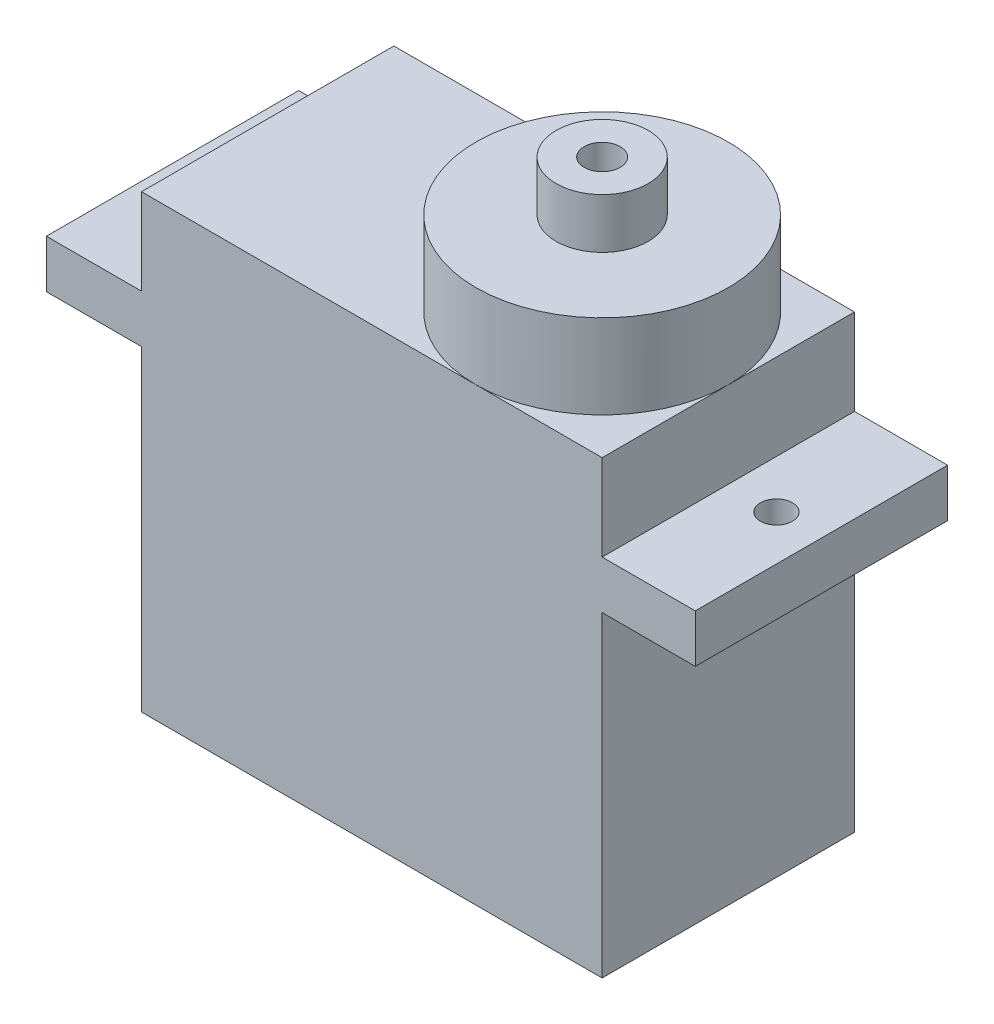
ISO-10303-21;
HEADER;
FILE_DESCRIPTION(('STEP AP214'),'2;1');
FILE_NAME('part.step','',(''),(''),'','','');
FILE_SCHEMA(('AUTOMOTIVE_DESIGN { 1 0 10303 214 1 1 1 1 }'));
ENDSEC;
DATA;
#1=APPLICATION_CONTEXT('core data for automotive mechanical design processes');
#2=APPLICATION_PROTOCOL_DEFINITION('international standard','automotive_design',2000,#1);
#3=PRODUCT_CONTEXT('',#1,'mechanical');
#4=PRODUCT('Part','Part','',(#3));
#5=PRODUCT_RELATED_PRODUCT_CATEGORY('part','',(#4));
#6=PRODUCT_DEFINITION_FORMATION('','',#4);
#7=PRODUCT_DEFINITION_CONTEXT('part definition',#1,'design');
#8=PRODUCT_DEFINITION('design','',#6,#7);
#9=PRODUCT_DEFINITION_SHAPE('','',#8);
#10=(LENGTH_UNIT() NAMED_UNIT(*) SI_UNIT(.MILLI.,.METRE.));
#11=(NAMED_UNIT(*) PLANE_ANGLE_UNIT() SI_UNIT($,.RADIAN.));
#12=(NAMED_UNIT(*) SI_UNIT($,.STERADIAN.) SOLID_ANGLE_UNIT());
#13=UNCERTAINTY_MEASURE_WITH_UNIT(LENGTH_MEASURE(1.E-05),#10,'distance_accuracy_value','');
#14=(GEOMETRIC_REPRESENTATION_CONTEXT(3) GLOBAL_UNCERTAINTY_ASSIGNED_CONTEXT((#13)) GLOBAL_UNIT_ASSIGNED_CONTEXT((#10,
#11,#12)) REPRESENTATION_CONTEXT('',''));
#15=CARTESIAN_POINT('',(0.,0.,0.));
#16=DIRECTION('',(0.,0.,1.));
#17=DIRECTION('',(1.,0.,0.));
#18=AXIS2_PLACEMENT_3D('',#15,#16,#17);
#19=CARTESIAN_POINT('',(-11.5,11.25,12.6));
#20=DIRECTION('',(0.,-1.,0.));
#21=DIRECTION('',(0.,0.,-1.));
#22=AXIS2_PLACEMENT_3D('',#19,#20,#21);
#23=PLANE('',#22);
#24=CARTESIAN_POINT('',(5.2,11.25,6.3));
#25=DIRECTION('',(0.,1.,0.));
#26=DIRECTION('',(0.,0.,1.));
#27=AXIS2_PLACEMENT_3D('',#24,#25,#26);
#28=CIRCLE('',#27,6.3);
#29=CARTESIAN_POINT('',(5.2,11.25,12.6));
#30=VERTEX_POINT('',#29);
#31=CARTESIAN_POINT('',(11.5,11.25,6.3));
#32=VERTEX_POINT('',#31);
#33=EDGE_CURVE('E160',#30,#32,#28,.T.);
#34=ORIENTED_EDGE('',*,*,#33,.F.);
#35=DIRECTION('',(-1.,0.,0.));
#36=VECTOR('',#35,1.);
#37=CARTESIAN_POINT('',(-11.5,11.25,12.6));
#38=LINE('',#37,#36);
#39=CARTESIAN_POINT('',(11.5,11.25,12.6));
#40=VERTEX_POINT('',#39);
#41=EDGE_CURVE('E141',#40,#30,#38,.T.);
#42=ORIENTED_EDGE('',*,*,#41,.F.);
#43=DIRECTION('',(0.,0.,-1.));
#44=VECTOR('',#43,1.);
#45=CARTESIAN_POINT('',(11.5,11.25,12.6));
#46=LINE('',#45,#44);
#47=EDGE_CURVE('E161',#40,#32,#46,.T.);
#48=ORIENTED_EDGE('',*,*,#47,.T.);
#49=EDGE_LOOP('',(#34,#42,#48));
#50=FACE_BOUND('',#49,.T.);
#51=ADVANCED_FACE('F41',(#50),#23,.F.);
#52=CARTESIAN_POINT('',(5.2,11.25,0.));
#53=VERTEX_POINT('',#52);
#54=EDGE_CURVE('E50',#32,#53,#28,.T.);
#55=ORIENTED_EDGE('',*,*,#54,.F.);
#56=CARTESIAN_POINT('',(11.5,11.25,0.));
#57=VERTEX_POINT('',#56);
#58=EDGE_CURVE('E167',#32,#57,#46,.T.);
#59=ORIENTED_EDGE('',*,*,#58,.T.);
#60=DIRECTION('',(-1.,0.,0.));
#61=VECTOR('',#60,1.);
#62=CARTESIAN_POINT('',(-11.5,11.25,0.));
#63=LINE('',#62,#61);
#64=EDGE_CURVE('E229',#57,#53,#63,.T.);
#65=ORIENTED_EDGE('',*,*,#64,.T.);
#66=EDGE_LOOP('',(#55,#59,#65));
#67=FACE_BOUND('',#66,.T.);
#68=ADVANCED_FACE('F244',(#67),#23,.F.);
#69=CARTESIAN_POINT('',(11.5,11.25,12.6));
#70=DIRECTION('',(-1.,0.,0.));
#71=DIRECTION('',(0.,-1.,0.));
#72=AXIS2_PLACEMENT_3D('',#69,#70,#71);
#73=PLANE('',#72);
#74=DIRECTION('',(0.,0.,-1.));
#75=VECTOR('',#74,1.);
#76=CARTESIAN_POINT('',(11.5,4.55,12.6));
#77=LINE('',#76,#75);
#78=CARTESIAN_POINT('',(11.5,4.55000000000001,12.6));
#79=VERTEX_POINT('',#78);
#80=CARTESIAN_POINT('',(11.5,4.55000000000001,0.));
#81=VERTEX_POINT('',#80);
#82=EDGE_CURVE('E215',#79,#81,#77,.T.);
#83=ORIENTED_EDGE('',*,*,#82,.F.);
#84=DIRECTION('',(0.,1.,0.));
#85=VECTOR('',#84,1.);
#86=CARTESIAN_POINT('',(11.5,11.25,12.6));
#87=LINE('',#86,#85);
#88=CARTESIAN_POINT('',(11.5,-11.25,12.6));
#89=VERTEX_POINT('',#88);
#90=EDGE_CURVE('E158',#89,#79,#87,.T.);
#91=ORIENTED_EDGE('',*,*,#90,.F.);
#92=DIRECTION('',(0.,0.,-1.));
#93=VECTOR('',#92,1.);
#94=CARTESIAN_POINT('',(11.5,-11.25,12.6));
#95=LINE('',#94,#93);
#96=CARTESIAN_POINT('',(11.5,-11.25,0.));
#97=VERTEX_POINT('',#96);
#98=EDGE_CURVE('E225',#89,#97,#95,.T.);
#99=ORIENTED_EDGE('',*,*,#98,.T.);
#100=DIRECTION('',(0.,1.,0.));
#101=VECTOR('',#100,1.);
#102=CARTESIAN_POINT('',(11.5,11.25,0.));
#103=LINE('',#102,#101);
#104=EDGE_CURVE('E226',#97,#81,#103,.T.);
#105=ORIENTED_EDGE('',*,*,#104,.T.);
#106=EDGE_LOOP('',(#83,#91,#99,#105));
#107=FACE_BOUND('',#106,.T.);
#108=ADVANCED_FACE('F279',(#107),#73,.F.);
#109=CARTESIAN_POINT('',(-11.5,11.25,12.6));
#110=DIRECTION('',(1.,0.,0.));
#111=DIRECTION('',(0.,1.,0.));
#112=AXIS2_PLACEMENT_3D('',#109,#110,#111);
#113=PLANE('',#112);
#114=DIRECTION('',(0.,0.,1.));
#115=VECTOR('',#114,1.);
#116=CARTESIAN_POINT('',(-11.5,4.55,12.6));
#117=LINE('',#116,#115);
#118=CARTESIAN_POINT('',(-11.5,4.55,0.));
#119=VERTEX_POINT('',#118);
#120=CARTESIAN_POINT('',(-11.5,4.55000000000001,12.6));
#121=VERTEX_POINT('',#120);
#122=EDGE_CURVE('E212',#119,#121,#117,.T.);
#123=ORIENTED_EDGE('',*,*,#122,.F.);
#124=DIRECTION('',(0.,-1.,0.));
#125=VECTOR('',#124,1.);
#126=CARTESIAN_POINT('',(-11.5,11.25,0.));
#127=LINE('',#126,#125);
#128=CARTESIAN_POINT('',(-11.5,-11.25,0.));
#129=VERTEX_POINT('',#128);
#130=EDGE_CURVE('E231',#119,#129,#127,.T.);
#131=ORIENTED_EDGE('',*,*,#130,.T.);
#132=DIRECTION('',(0.,0.,-1.));
#133=VECTOR('',#132,1.);
#134=CARTESIAN_POINT('',(-11.5,-11.25,12.6));
#135=LINE('',#134,#133);
#136=CARTESIAN_POINT('',(-11.5,-11.25,12.6));
#137=VERTEX_POINT('',#136);
#138=EDGE_CURVE('E238',#137,#129,#135,.T.);
#139=ORIENTED_EDGE('',*,*,#138,.F.);
#140=DIRECTION('',(0.,-1.,0.));
#141=VECTOR('',#140,1.);
#142=CARTESIAN_POINT('',(-11.5,11.25,12.6));
#143=LINE('',#142,#141);
#144=EDGE_CURVE('E152',#121,#137,#143,.T.);
#145=ORIENTED_EDGE('',*,*,#144,.F.);
#146=EDGE_LOOP('',(#123,#131,#139,#145));
#147=FACE_BOUND('',#146,.T.);
#148=ADVANCED_FACE('F268',(#147),#113,.F.);
#149=CARTESIAN_POINT('',(11.5,6.95,12.6));
#150=VERTEX_POINT('',#149);
#151=EDGE_CURVE('E147',#150,#40,#87,.T.);
#152=ORIENTED_EDGE('',*,*,#151,.F.);
#153=DIRECTION('',(0.,0.,-1.));
#154=VECTOR('',#153,1.);
#155=CARTESIAN_POINT('',(11.5,6.95,12.6));
#156=LINE('',#155,#154);
#157=CARTESIAN_POINT('',(11.5,6.95,0.));
#158=VERTEX_POINT('',#157);
#159=EDGE_CURVE('E209',#150,#158,#156,.T.);
#160=ORIENTED_EDGE('',*,*,#159,.T.);
#161=EDGE_CURVE('E218',#158,#57,#103,.T.);
#162=ORIENTED_EDGE('',*,*,#161,.T.);
#163=ORIENTED_EDGE('',*,*,#58,.F.);
#164=ORIENTED_EDGE('',*,*,#47,.F.);
#165=EDGE_LOOP('',(#152,#160,#162,#163,#164));
#166=FACE_BOUND('',#165,.T.);
#167=ADVANCED_FACE('F43',(#166),#73,.F.);
#168=EDGE_CURVE('E65',#53,#30,#28,.T.);
#169=ORIENTED_EDGE('',*,*,#168,.F.);
#170=CARTESIAN_POINT('',(-11.5,11.25,0.));
#171=VERTEX_POINT('',#170);
#172=EDGE_CURVE('E228',#53,#171,#63,.T.);
#173=ORIENTED_EDGE('',*,*,#172,.T.);
#174=DIRECTION('',(0.,0.,-1.));
#175=VECTOR('',#174,1.);
#176=CARTESIAN_POINT('',(-11.5,11.25,12.6));
#177=LINE('',#176,#175);
#178=CARTESIAN_POINT('',(-11.5,11.25,12.6));
#179=VERTEX_POINT('',#178);
#180=EDGE_CURVE('E156',#179,#171,#177,.T.);
#181=ORIENTED_EDGE('',*,*,#180,.F.);
#182=EDGE_CURVE('E144',#30,#179,#38,.T.);
#183=ORIENTED_EDGE('',*,*,#182,.F.);
#184=EDGE_LOOP('',(#169,#173,#181,#183));
#185=FACE_BOUND('',#184,.T.);
#186=ADVANCED_FACE('F154',(#185),#23,.F.);
#187=CARTESIAN_POINT('',(-11.5,6.95,0.));
#188=VERTEX_POINT('',#187);
#189=EDGE_CURVE('E232',#171,#188,#127,.T.);
#190=ORIENTED_EDGE('',*,*,#189,.T.);
#191=DIRECTION('',(0.,0.,1.));
#192=VECTOR('',#191,1.);
#193=CARTESIAN_POINT('',(-11.5,6.95,12.6));
#194=LINE('',#193,#192);
#195=CARTESIAN_POINT('',(-11.5,6.95,12.6));
#196=VERTEX_POINT('',#195);
#197=EDGE_CURVE('E207',#188,#196,#194,.T.);
#198=ORIENTED_EDGE('',*,*,#197,.T.);
#199=EDGE_CURVE('E221',#179,#196,#143,.T.);
#200=ORIENTED_EDGE('',*,*,#199,.F.);
#201=ORIENTED_EDGE('',*,*,#180,.T.);
#202=EDGE_LOOP('',(#190,#198,#200,#201));
#203=FACE_BOUND('',#202,.T.);
#204=ADVANCED_FACE('F254',(#203),#113,.F.);
#205=CARTESIAN_POINT('',(-11.5,-11.25,12.6));
#206=DIRECTION('',(0.,1.,0.));
#207=DIRECTION('',(0.,0.,1.));
#208=AXIS2_PLACEMENT_3D('',#205,#206,#207);
#209=PLANE('',#208);
#210=DIRECTION('',(1.,0.,0.));
#211=VECTOR('',#210,1.);
#212=CARTESIAN_POINT('',(-11.5,-11.25,0.));
#213=LINE('',#212,#211);
#214=EDGE_CURVE('E234',#129,#97,#213,.T.);
#215=ORIENTED_EDGE('',*,*,#214,.T.);
#216=ORIENTED_EDGE('',*,*,#98,.F.);
#217=DIRECTION('',(1.,0.,0.));
#218=VECTOR('',#217,1.);
#219=CARTESIAN_POINT('',(-11.5,-11.25,12.6));
#220=LINE('',#219,#218);
#221=EDGE_CURVE('E223',#137,#89,#220,.T.);
#222=ORIENTED_EDGE('',*,*,#221,.F.);
#223=ORIENTED_EDGE('',*,*,#138,.T.);
#224=EDGE_LOOP('',(#215,#216,#222,#223));
#225=FACE_BOUND('',#224,.T.);
#226=ADVANCED_FACE('F275',(#225),#209,.F.);
#227=CARTESIAN_POINT('',(0.,0.,12.6));
#228=DIRECTION('',(0.,0.,1.));
#229=DIRECTION('',(1.,0.,0.));
#230=AXIS2_PLACEMENT_3D('',#227,#228,#229);
#231=PLANE('',#230);
#232=ORIENTED_EDGE('',*,*,#199,.T.);
#233=DIRECTION('',(1.,0.,0.));
#234=VECTOR('',#233,1.);
#235=CARTESIAN_POINT('',(-16.25,6.95,12.6));
#236=LINE('',#235,#234);
#237=CARTESIAN_POINT('',(-16.25,6.95,12.6));
#238=VERTEX_POINT('',#237);
#239=EDGE_CURVE('E178',#238,#196,#236,.T.);
#240=ORIENTED_EDGE('',*,*,#239,.F.);
#241=DIRECTION('',(0.,-1.,0.));
#242=VECTOR('',#241,1.);
#243=CARTESIAN_POINT('',(-16.25,6.95,12.6));
#244=LINE('',#243,#242);
#245=CARTESIAN_POINT('',(-16.25,4.55,12.6));
#246=VERTEX_POINT('',#245);
#247=EDGE_CURVE('E181',#238,#246,#244,.T.);
#248=ORIENTED_EDGE('',*,*,#247,.T.);
#249=DIRECTION('',(1.,0.,0.));
#250=VECTOR('',#249,1.);
#251=CARTESIAN_POINT('',(-16.25,4.55,12.6));
#252=LINE('',#251,#250);
#253=EDGE_CURVE('E170',#246,#121,#252,.T.);
#254=ORIENTED_EDGE('',*,*,#253,.T.);
#255=ORIENTED_EDGE('',*,*,#144,.T.);
#256=ORIENTED_EDGE('',*,*,#221,.T.);
#257=ORIENTED_EDGE('',*,*,#90,.T.);
#258=CARTESIAN_POINT('',(16.15,4.55,12.6));
#259=VERTEX_POINT('',#258);
#260=EDGE_CURVE('E174',#79,#259,#252,.T.);
#261=ORIENTED_EDGE('',*,*,#260,.T.);
#262=DIRECTION('',(0.,-1.,0.));
#263=VECTOR('',#262,1.);
#264=CARTESIAN_POINT('',(16.15,6.95,12.6));
#265=LINE('',#264,#263);
#266=CARTESIAN_POINT('',(16.15,6.95,12.6));
#267=VERTEX_POINT('',#266);
#268=EDGE_CURVE('E173',#267,#259,#265,.T.);
#269=ORIENTED_EDGE('',*,*,#268,.F.);
#270=EDGE_CURVE('E177',#150,#267,#236,.T.);
#271=ORIENTED_EDGE('',*,*,#270,.F.);
#272=ORIENTED_EDGE('',*,*,#151,.T.);
#273=ORIENTED_EDGE('',*,*,#41,.T.);
#274=ORIENTED_EDGE('',*,*,#182,.T.);
#275=EDGE_LOOP('',(#232,#240,#248,#254,#255,#256,#257,#261,#269,#271,#272,#273,#274));
#276=FACE_BOUND('',#275,.T.);
#277=ADVANCED_FACE('F143',(#276),#231,.T.);
#278=CARTESIAN_POINT('',(0.,0.,0.));
#279=DIRECTION('',(0.,0.,1.));
#280=DIRECTION('',(1.,0.,0.));
#281=AXIS2_PLACEMENT_3D('',#278,#279,#280);
#282=PLANE('',#281);
#283=ORIENTED_EDGE('',*,*,#161,.F.);
#284=DIRECTION('',(1.,0.,0.));
#285=VECTOR('',#284,1.);
#286=CARTESIAN_POINT('',(-16.25,6.95,0.));
#287=LINE('',#286,#285);
#288=CARTESIAN_POINT('',(16.15,6.95,0.));
#289=VERTEX_POINT('',#288);
#290=EDGE_CURVE('E191',#158,#289,#287,.T.);
#291=ORIENTED_EDGE('',*,*,#290,.T.);
#292=DIRECTION('',(0.,-1.,0.));
#293=VECTOR('',#292,1.);
#294=CARTESIAN_POINT('',(16.15,6.95,0.));
#295=LINE('',#294,#293);
#296=CARTESIAN_POINT('',(16.15,4.55,0.));
#297=VERTEX_POINT('',#296);
#298=EDGE_CURVE('E187',#289,#297,#295,.T.);
#299=ORIENTED_EDGE('',*,*,#298,.T.);
#300=DIRECTION('',(1.,0.,0.));
#301=VECTOR('',#300,1.);
#302=CARTESIAN_POINT('',(-16.25,4.55,0.));
#303=LINE('',#302,#301);
#304=EDGE_CURVE('E188',#81,#297,#303,.T.);
#305=ORIENTED_EDGE('',*,*,#304,.F.);
#306=ORIENTED_EDGE('',*,*,#104,.F.);
#307=ORIENTED_EDGE('',*,*,#214,.F.);
#308=ORIENTED_EDGE('',*,*,#130,.F.);
#309=CARTESIAN_POINT('',(-16.25,4.55,0.));
#310=VERTEX_POINT('',#309);
#311=EDGE_CURVE('E184',#310,#119,#303,.T.);
#312=ORIENTED_EDGE('',*,*,#311,.F.);
#313=DIRECTION('',(0.,-1.,0.));
#314=VECTOR('',#313,1.);
#315=CARTESIAN_POINT('',(-16.25,6.95,0.));
#316=LINE('',#315,#314);
#317=CARTESIAN_POINT('',(-16.25,6.95,0.));
#318=VERTEX_POINT('',#317);
#319=EDGE_CURVE('E195',#318,#310,#316,.T.);
#320=ORIENTED_EDGE('',*,*,#319,.F.);
#321=EDGE_CURVE('E192',#318,#188,#287,.T.);
#322=ORIENTED_EDGE('',*,*,#321,.T.);
#323=ORIENTED_EDGE('',*,*,#189,.F.);
#324=ORIENTED_EDGE('',*,*,#172,.F.);
#325=ORIENTED_EDGE('',*,*,#64,.F.);
#326=EDGE_LOOP('',(#283,#291,#299,#305,#306,#307,#308,#312,#320,#322,#323,#324,#325));
#327=FACE_BOUND('',#326,.T.);
#328=ADVANCED_FACE('F250',(#327),#282,.F.);
#329=CARTESIAN_POINT('',(-16.25,6.95,12.6));
#330=DIRECTION('',(1.,0.,0.));
#331=DIRECTION('',(0.,0.,-1.));
#332=AXIS2_PLACEMENT_3D('',#329,#330,#331);
#333=PLANE('',#332);
#334=ORIENTED_EDGE('',*,*,#319,.T.);
#335=DIRECTION('',(0.,0.,-1.));
#336=VECTOR('',#335,1.);
#337=CARTESIAN_POINT('',(-16.25,4.55,12.6));
#338=LINE('',#337,#336);
#339=EDGE_CURVE('E183',#246,#310,#338,.T.);
#340=ORIENTED_EDGE('',*,*,#339,.F.);
#341=ORIENTED_EDGE('',*,*,#247,.F.);
#342=DIRECTION('',(0.,0.,-1.));
#343=VECTOR('',#342,1.);
#344=CARTESIAN_POINT('',(-16.25,6.95,12.6));
#345=LINE('',#344,#343);
#346=EDGE_CURVE('E199',#238,#318,#345,.T.);
#347=ORIENTED_EDGE('',*,*,#346,.T.);
#348=EDGE_LOOP('',(#334,#340,#341,#347));
#349=FACE_BOUND('',#348,.T.);
#350=ADVANCED_FACE('F262',(#349),#333,.F.);
#351=CARTESIAN_POINT('',(-16.25,6.95,12.6));
#352=DIRECTION('',(0.,1.,0.));
#353=DIRECTION('',(0.,0.,1.));
#354=AXIS2_PLACEMENT_3D('',#351,#352,#353);
#355=PLANE('',#354);
#356=CARTESIAN_POINT('',(-13.9,6.95,6.3));
#357=DIRECTION('',(0.,1.,0.));
#358=DIRECTION('',(0.,0.,1.));
#359=AXIS2_PLACEMENT_3D('',#356,#357,#358);
#360=CIRCLE('',#359,0.799999999999988);
#361=CARTESIAN_POINT('',(-13.9,6.95,7.09999999999999));
#362=VERTEX_POINT('',#361);
#363=EDGE_CURVE('E530',#362,#362,#360,.T.);
#364=ORIENTED_EDGE('',*,*,#363,.F.);
#365=EDGE_LOOP('',(#364));
#366=FACE_BOUND('',#365,.T.);
#367=ORIENTED_EDGE('',*,*,#197,.F.);
#368=ORIENTED_EDGE('',*,*,#321,.F.);
#369=ORIENTED_EDGE('',*,*,#346,.F.);
#370=ORIENTED_EDGE('',*,*,#239,.T.);
#371=EDGE_LOOP('',(#367,#368,#369,#370));
#372=FACE_BOUND('',#371,.T.);
#373=ADVANCED_FACE('F256',(#366,#372),#355,.T.);
#374=CARTESIAN_POINT('',(-16.25,4.55,12.6));
#375=DIRECTION('',(0.,1.,0.));
#376=DIRECTION('',(0.,0.,1.));
#377=AXIS2_PLACEMENT_3D('',#374,#375,#376);
#378=PLANE('',#377);
#379=CARTESIAN_POINT('',(-13.9,4.55,6.3));
#380=DIRECTION('',(0.,1.,0.));
#381=DIRECTION('',(0.,0.,1.));
#382=AXIS2_PLACEMENT_3D('',#379,#380,#381);
#383=CIRCLE('',#382,0.799999999999993);
#384=CARTESIAN_POINT('',(-13.9,4.55,7.09999999999999));
#385=VERTEX_POINT('',#384);
#386=EDGE_CURVE('E45',#385,#385,#383,.T.);
#387=ORIENTED_EDGE('',*,*,#386,.T.);
#388=EDGE_LOOP('',(#387));
#389=FACE_BOUND('',#388,.T.);
#390=ORIENTED_EDGE('',*,*,#311,.T.);
#391=ORIENTED_EDGE('',*,*,#122,.T.);
#392=ORIENTED_EDGE('',*,*,#253,.F.);
#393=ORIENTED_EDGE('',*,*,#339,.T.);
#394=EDGE_LOOP('',(#390,#391,#392,#393));
#395=FACE_BOUND('',#394,.T.);
#396=ADVANCED_FACE('F265',(#389,#395),#378,.F.);
#397=CARTESIAN_POINT('',(13.9,4.55,6.3));
#398=DIRECTION('',(0.,1.,0.));
#399=DIRECTION('',(0.,0.,1.));
#400=AXIS2_PLACEMENT_3D('',#397,#398,#399);
#401=CIRCLE('',#400,0.799999999999993);
#402=CARTESIAN_POINT('',(13.9,4.55,7.09999999999999));
#403=VERTEX_POINT('',#402);
#404=EDGE_CURVE('E535',#403,#403,#401,.T.);
#405=ORIENTED_EDGE('',*,*,#404,.T.);
#406=EDGE_LOOP('',(#405));
#407=FACE_BOUND('',#406,.T.);
#408=ORIENTED_EDGE('',*,*,#260,.F.);
#409=ORIENTED_EDGE('',*,*,#82,.T.);
#410=ORIENTED_EDGE('',*,*,#304,.T.);
#411=DIRECTION('',(0.,0.,-1.));
#412=VECTOR('',#411,1.);
#413=CARTESIAN_POINT('',(16.15,4.55,12.6));
#414=LINE('',#413,#412);
#415=EDGE_CURVE('E204',#259,#297,#414,.T.);
#416=ORIENTED_EDGE('',*,*,#415,.F.);
#417=EDGE_LOOP('',(#408,#409,#410,#416));
#418=FACE_BOUND('',#417,.T.);
#419=ADVANCED_FACE('F282',(#407,#418),#378,.F.);
#420=CARTESIAN_POINT('',(13.9,6.95,6.3));
#421=DIRECTION('',(0.,1.,0.));
#422=DIRECTION('',(0.,0.,1.));
#423=AXIS2_PLACEMENT_3D('',#420,#421,#422);
#424=CIRCLE('',#423,0.799999999999988);
#425=CARTESIAN_POINT('',(13.9,6.95,7.09999999999999));
#426=VERTEX_POINT('',#425);
#427=EDGE_CURVE('E533',#426,#426,#424,.T.);
#428=ORIENTED_EDGE('',*,*,#427,.F.);
#429=EDGE_LOOP('',(#428));
#430=FACE_BOUND('',#429,.T.);
#431=ORIENTED_EDGE('',*,*,#159,.F.);
#432=ORIENTED_EDGE('',*,*,#270,.T.);
#433=DIRECTION('',(0.,0.,-1.));
#434=VECTOR('',#433,1.);
#435=CARTESIAN_POINT('',(16.15,6.95,12.6));
#436=LINE('',#435,#434);
#437=EDGE_CURVE('E201',#267,#289,#436,.T.);
#438=ORIENTED_EDGE('',*,*,#437,.T.);
#439=ORIENTED_EDGE('',*,*,#290,.F.);
#440=EDGE_LOOP('',(#431,#432,#438,#439));
#441=FACE_BOUND('',#440,.T.);
#442=ADVANCED_FACE('F300',(#430,#441),#355,.T.);
#443=CARTESIAN_POINT('',(16.15,6.95,12.6));
#444=DIRECTION('',(1.,0.,0.));
#445=DIRECTION('',(0.,0.,-1.));
#446=AXIS2_PLACEMENT_3D('',#443,#444,#445);
#447=PLANE('',#446);
#448=ORIENTED_EDGE('',*,*,#298,.F.);
#449=ORIENTED_EDGE('',*,*,#437,.F.);
#450=ORIENTED_EDGE('',*,*,#268,.T.);
#451=ORIENTED_EDGE('',*,*,#415,.T.);
#452=EDGE_LOOP('',(#448,#449,#450,#451));
#453=FACE_BOUND('',#452,.T.);
#454=ADVANCED_FACE('F291',(#453),#447,.T.);
#455=CARTESIAN_POINT('',(5.2,15.45,6.3));
#456=DIRECTION('',(0.,-1.,0.));
#457=DIRECTION('',(0.,0.,-1.));
#458=AXIS2_PLACEMENT_3D('',#455,#456,#457);
#459=CYLINDRICAL_SURFACE('',#458,6.3);
#460=CARTESIAN_POINT('',(5.2,15.45,6.3));
#461=DIRECTION('',(0.,1.,0.));
#462=DIRECTION('',(0.,0.,1.));
#463=AXIS2_PLACEMENT_3D('',#460,#461,#462);
#464=CIRCLE('',#463,6.3);
#465=CARTESIAN_POINT('',(5.2,15.45,12.6));
#466=VERTEX_POINT('',#465);
#467=EDGE_CURVE('E163',#466,#466,#464,.T.);
#468=ORIENTED_EDGE('',*,*,#467,.F.);
#469=EDGE_LOOP('',(#468));
#470=FACE_BOUND('',#469,.T.);
#471=ORIENTED_EDGE('',*,*,#33,.T.);
#472=ORIENTED_EDGE('',*,*,#54,.T.);
#473=ORIENTED_EDGE('',*,*,#168,.T.);
#474=EDGE_LOOP('',(#471,#472,#473));
#475=FACE_BOUND('',#474,.T.);
#476=ADVANCED_FACE('F166',(#470,#475),#459,.T.);
#477=CARTESIAN_POINT('',(5.2,15.45,6.3));
#478=DIRECTION('',(0.,1.,0.));
#479=DIRECTION('',(0.,0.,1.));
#480=AXIS2_PLACEMENT_3D('',#477,#478,#479);
#481=PLANE('',#480);
#482=CARTESIAN_POINT('',(5.2,15.45,6.3));
#483=DIRECTION('',(0.,1.,0.));
#484=DIRECTION('',(0.,0.,1.));
#485=AXIS2_PLACEMENT_3D('',#482,#483,#484);
#486=CIRCLE('',#485,2.3);
#487=CARTESIAN_POINT('',(5.2,15.45,8.6));
#488=VERTEX_POINT('',#487);
#489=EDGE_CURVE('E11',#488,#488,#486,.T.);
#490=ORIENTED_EDGE('',*,*,#489,.F.);
#491=EDGE_LOOP('',(#490));
#492=FACE_BOUND('',#491,.T.);
#493=ORIENTED_EDGE('',*,*,#467,.T.);
#494=EDGE_LOOP('',(#493));
#495=FACE_BOUND('',#494,.T.);
#496=ADVANCED_FACE('F288',(#492,#495),#481,.T.);
#497=CARTESIAN_POINT('',(5.2,17.95,6.3));
#498=DIRECTION('',(0.,-1.,0.));
#499=DIRECTION('',(0.,0.,-1.));
#500=AXIS2_PLACEMENT_3D('',#497,#498,#499);
#501=CYLINDRICAL_SURFACE('',#500,2.3);
#502=CARTESIAN_POINT('',(5.2,17.95,6.3));
#503=DIRECTION('',(0.,1.,0.));
#504=DIRECTION('',(0.,0.,1.));
#505=AXIS2_PLACEMENT_3D('',#502,#503,#504);
#506=CIRCLE('',#505,2.3);
#507=CARTESIAN_POINT('',(5.2,17.95,8.6));
#508=VERTEX_POINT('',#507);
#509=EDGE_CURVE('E164',#508,#508,#506,.T.);
#510=ORIENTED_EDGE('',*,*,#509,.F.);
#511=EDGE_LOOP('',(#510));
#512=FACE_BOUND('',#511,.T.);
#513=ORIENTED_EDGE('',*,*,#489,.T.);
#514=EDGE_LOOP('',(#513));
#515=FACE_BOUND('',#514,.T.);
#516=ADVANCED_FACE('F297',(#512,#515),#501,.T.);
#517=CARTESIAN_POINT('',(5.2,17.95,6.3));
#518=DIRECTION('',(0.,1.,0.));
#519=DIRECTION('',(0.,0.,1.));
#520=AXIS2_PLACEMENT_3D('',#517,#518,#519);
#521=PLANE('',#520);
#522=CARTESIAN_POINT('',(5.2,17.95,6.3));
#523=DIRECTION('',(0.,1.,0.));
#524=DIRECTION('',(0.,0.,1.));
#525=AXIS2_PLACEMENT_3D('',#522,#523,#524);
#526=CIRCLE('',#525,0.899999999999999);
#527=CARTESIAN_POINT('',(5.2,17.95,7.2));
#528=VERTEX_POINT('',#527);
#529=EDGE_CURVE('E542',#528,#528,#526,.T.);
#530=ORIENTED_EDGE('',*,*,#529,.F.);
#531=EDGE_LOOP('',(#530));
#532=FACE_BOUND('',#531,.T.);
#533=ORIENTED_EDGE('',*,*,#509,.T.);
#534=EDGE_LOOP('',(#533));
#535=FACE_BOUND('',#534,.T.);
#536=ADVANCED_FACE('F414',(#532,#535),#521,.T.);
#537=CARTESIAN_POINT('',(5.2,17.95,6.3));
#538=DIRECTION('',(0.,-1.,0.));
#539=DIRECTION('',(0.,0.,-1.));
#540=AXIS2_PLACEMENT_3D('',#537,#538,#539);
#541=CYLINDRICAL_SURFACE('',#540,0.899999999999999);
#542=ORIENTED_EDGE('',*,*,#529,.T.);
#543=EDGE_LOOP('',(#542));
#544=FACE_BOUND('',#543,.T.);
#545=CARTESIAN_POINT('',(5.2,15.45,6.3));
#546=DIRECTION('',(0.,1.,0.));
#547=DIRECTION('',(0.,0.,1.));
#548=AXIS2_PLACEMENT_3D('',#545,#546,#547);
#549=CIRCLE('',#548,0.899999999999999);
#550=CARTESIAN_POINT('',(5.2,15.45,7.2));
#551=VERTEX_POINT('',#550);
#552=EDGE_CURVE('E541',#551,#551,#549,.T.);
#553=ORIENTED_EDGE('',*,*,#552,.F.);
#554=EDGE_LOOP('',(#553));
#555=FACE_BOUND('',#554,.T.);
#556=ADVANCED_FACE('F425',(#544,#555),#541,.F.);
#557=CARTESIAN_POINT('',(5.2,15.45,6.3));
#558=DIRECTION('',(0.,1.,0.));
#559=DIRECTION('',(0.,0.,1.));
#560=AXIS2_PLACEMENT_3D('',#557,#558,#559);
#561=PLANE('',#560);
#562=ORIENTED_EDGE('',*,*,#552,.T.);
#563=EDGE_LOOP('',(#562));
#564=FACE_BOUND('',#563,.T.);
#565=ADVANCED_FACE('F436',(#564),#561,.T.);
#566=CARTESIAN_POINT('',(13.9,6.95,6.3));
#567=DIRECTION('',(0.,1.,0.));
#568=DIRECTION('',(0.,0.,1.));
#569=AXIS2_PLACEMENT_3D('',#566,#567,#568);
#570=CYLINDRICAL_SURFACE('',#569,0.799999999999993);
#571=ORIENTED_EDGE('',*,*,#427,.T.);
#572=EDGE_LOOP('',(#571));
#573=FACE_BOUND('',#572,.T.);
#574=ORIENTED_EDGE('',*,*,#404,.F.);
#575=EDGE_LOOP('',(#574));
#576=FACE_BOUND('',#575,.T.);
#577=ADVANCED_FACE('F447',(#573,#576),#570,.F.);
#578=CARTESIAN_POINT('',(-13.9,6.95,6.3));
#579=DIRECTION('',(0.,1.,0.));
#580=DIRECTION('',(0.,0.,1.));
#581=AXIS2_PLACEMENT_3D('',#578,#579,#580);
#582=CYLINDRICAL_SURFACE('',#581,0.799999999999993);
#583=ORIENTED_EDGE('',*,*,#363,.T.);
#584=EDGE_LOOP('',(#583));
#585=FACE_BOUND('',#584,.T.);
#586=ORIENTED_EDGE('',*,*,#386,.F.);
#587=EDGE_LOOP('',(#586));
#588=FACE_BOUND('',#587,.T.);
#589=ADVANCED_FACE('F497',(#585,#588),#582,.F.);
#590=CLOSED_SHELL('',(#51,#68,#108,#148,#167,#186,#204,#226,#277,#328,#350,#373,#396,#419,#442,
#454,#476,#496,#516,#536,#556,#565,#577,#589));
#591=MANIFOLD_SOLID_BREP('B2',#590);
#592=ADVANCED_BREP_SHAPE_REPRESENTATION('',(#18,#591),#14);
#593=SHAPE_DEFINITION_REPRESENTATION(#9,#592);
ENDSEC;
END-ISO-10303-21;
